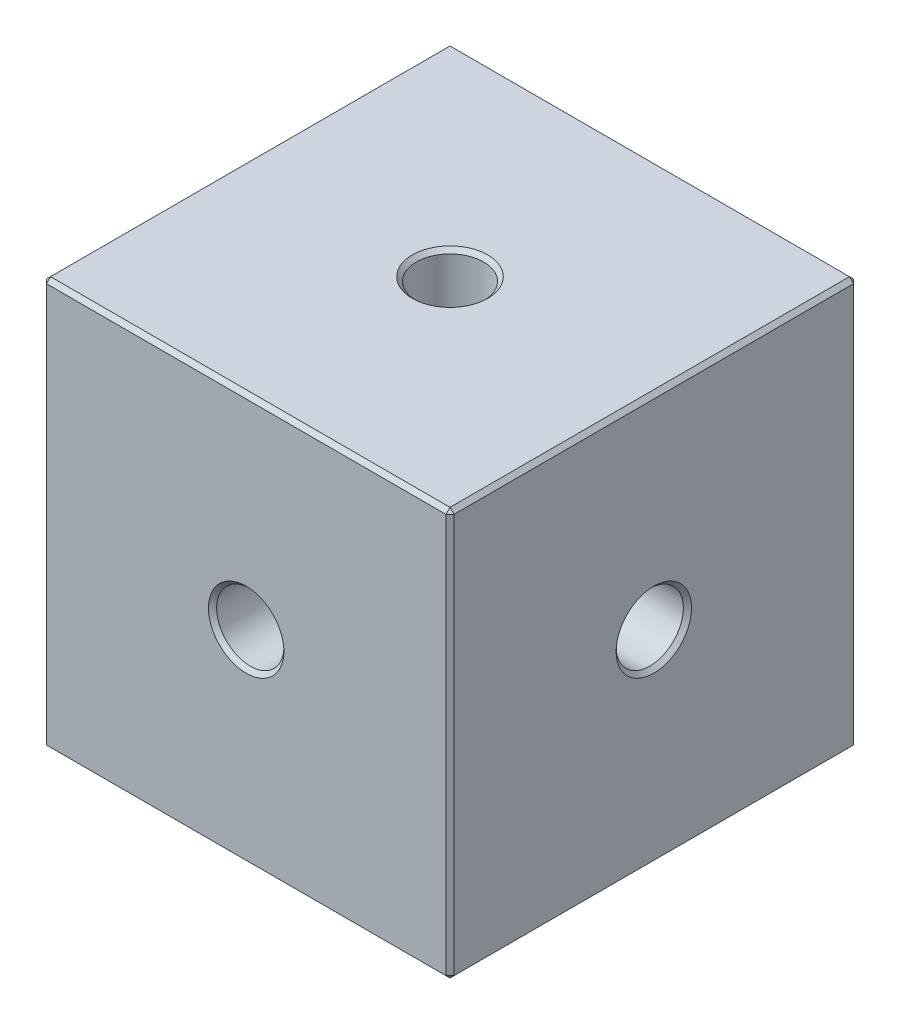
ISO-10303-21;
HEADER;
FILE_DESCRIPTION(('STEP AP214'),'2;1');
FILE_NAME('part.step','',(''),(''),'','','');
FILE_SCHEMA(('AUTOMOTIVE_DESIGN { 1 0 10303 214 1 1 1 1 }'));
ENDSEC;
DATA;
#1=APPLICATION_CONTEXT('core data for automotive mechanical design processes');
#2=APPLICATION_PROTOCOL_DEFINITION('international standard','automotive_design',2000,#1);
#3=PRODUCT_CONTEXT('',#1,'mechanical');
#4=PRODUCT('Part','Part','',(#3));
#5=PRODUCT_RELATED_PRODUCT_CATEGORY('part','',(#4));
#6=PRODUCT_DEFINITION_FORMATION('','',#4);
#7=PRODUCT_DEFINITION_CONTEXT('part definition',#1,'design');
#8=PRODUCT_DEFINITION('design','',#6,#7);
#9=PRODUCT_DEFINITION_SHAPE('','',#8);
#10=(LENGTH_UNIT() NAMED_UNIT(*) SI_UNIT(.MILLI.,.METRE.));
#11=(NAMED_UNIT(*) PLANE_ANGLE_UNIT() SI_UNIT($,.RADIAN.));
#12=(NAMED_UNIT(*) SI_UNIT($,.STERADIAN.) SOLID_ANGLE_UNIT());
#13=UNCERTAINTY_MEASURE_WITH_UNIT(LENGTH_MEASURE(1.E-05),#10,'distance_accuracy_value','');
#14=(GEOMETRIC_REPRESENTATION_CONTEXT(3) GLOBAL_UNCERTAINTY_ASSIGNED_CONTEXT((#13)) GLOBAL_UNIT_ASSIGNED_CONTEXT((#10,
#11,#12)) REPRESENTATION_CONTEXT('',''));
#15=CARTESIAN_POINT('',(0.,0.,0.));
#16=DIRECTION('',(0.,0.,1.));
#17=DIRECTION('',(1.,0.,0.));
#18=AXIS2_PLACEMENT_3D('',#15,#16,#17);
#19=CARTESIAN_POINT('',(0.,0.,10.));
#20=DIRECTION('',(0.,0.,1.));
#21=DIRECTION('',(1.,0.,0.));
#22=AXIS2_PLACEMENT_3D('',#19,#20,#21);
#23=CYLINDRICAL_SURFACE('',#22,1.65);
#24=CARTESIAN_POINT('',(0.,0.,9.80000000000001));
#25=DIRECTION('',(0.,0.,-1.));
#26=DIRECTION('',(-1.,0.,0.));
#27=AXIS2_PLACEMENT_3D('',#24,#25,#26);
#28=CIRCLE('',#27,1.65);
#29=CARTESIAN_POINT('',(-1.65,0.,9.80000000000001));
#30=VERTEX_POINT('',#29);
#31=EDGE_CURVE('E251',#30,#30,#28,.F.);
#32=ORIENTED_EDGE('',*,*,#31,.T.);
#33=EDGE_LOOP('',(#32));
#34=FACE_BOUND('',#33,.T.);
#35=CARTESIAN_POINT('',(0.,0.,0.));
#36=DIRECTION('',(0.,0.707106781186547,0.707106781186547));
#37=DIRECTION('',(0.,-0.707106781186547,0.707106781186547));
#38=AXIS2_PLACEMENT_3D('',#35,#36,#37);
#39=ELLIPSE('',#38,2.3334523779156,1.65);
#40=CARTESIAN_POINT('',(1.1667261889578,-1.1667261889578,1.1667261889578));
#41=VERTEX_POINT('',#40);
#42=CARTESIAN_POINT('',(-1.1667261889578,-1.1667261889578,1.1667261889578));
#43=VERTEX_POINT('',#42);
#44=EDGE_CURVE('E167',#41,#43,#39,.F.);
#45=ORIENTED_EDGE('',*,*,#44,.T.);
#46=CARTESIAN_POINT('',(0.,0.,0.));
#47=DIRECTION('',(0.707106781186548,0.,0.707106781186547));
#48=DIRECTION('',(-0.707106781186547,0.,0.707106781186547));
#49=AXIS2_PLACEMENT_3D('',#46,#47,#48);
#50=ELLIPSE('',#49,2.3334523779156,1.65);
#51=CARTESIAN_POINT('',(-1.1667261889578,1.1667261889578,1.1667261889578));
#52=VERTEX_POINT('',#51);
#53=EDGE_CURVE('E161',#43,#52,#50,.F.);
#54=ORIENTED_EDGE('',*,*,#53,.T.);
#55=CARTESIAN_POINT('',(0.,0.,0.));
#56=DIRECTION('',(0.,-0.707106781186547,0.707106781186547));
#57=DIRECTION('',(0.,0.707106781186547,0.707106781186547));
#58=AXIS2_PLACEMENT_3D('',#55,#56,#57);
#59=ELLIPSE('',#58,2.3334523779156,1.65);
#60=CARTESIAN_POINT('',(1.1667261889578,1.1667261889578,1.1667261889578));
#61=VERTEX_POINT('',#60);
#62=EDGE_CURVE('E181',#52,#61,#59,.F.);
#63=ORIENTED_EDGE('',*,*,#62,.T.);
#64=CARTESIAN_POINT('',(0.,0.,0.));
#65=DIRECTION('',(-0.707106781186547,0.,0.707106781186547));
#66=DIRECTION('',(0.707106781186548,0.,0.707106781186547));
#67=AXIS2_PLACEMENT_3D('',#64,#65,#66);
#68=ELLIPSE('',#67,2.3334523779156,1.65);
#69=EDGE_CURVE('E618',#61,#41,#68,.F.);
#70=ORIENTED_EDGE('',*,*,#69,.T.);
#71=EDGE_LOOP('',(#45,#54,#63,#70));
#72=FACE_BOUND('',#71,.T.);
#73=ADVANCED_FACE('F41',(#34,#72),#23,.F.);
#74=CARTESIAN_POINT('',(10.,10.,-10.));
#75=DIRECTION('',(-1.,0.,0.));
#76=DIRECTION('',(0.,0.,1.));
#77=AXIS2_PLACEMENT_3D('',#74,#75,#76);
#78=PLANE('',#77);
#79=CARTESIAN_POINT('',(10.,0.,0.));
#80=DIRECTION('',(-1.,0.,0.));
#81=DIRECTION('',(0.,0.,1.));
#82=AXIS2_PLACEMENT_3D('',#79,#80,#81);
#83=CIRCLE('',#82,1.85);
#84=CARTESIAN_POINT('',(10.,0.,1.85));
#85=VERTEX_POINT('',#84);
#86=EDGE_CURVE('E248',#85,#85,#83,.T.);
#87=ORIENTED_EDGE('',*,*,#86,.T.);
#88=EDGE_LOOP('',(#87));
#89=FACE_BOUND('',#88,.T.);
#90=DIRECTION('',(0.,0.,-1.));
#91=VECTOR('',#90,1.);
#92=CARTESIAN_POINT('',(10.,-9.8,-10.));
#93=LINE('',#92,#91);
#94=CARTESIAN_POINT('',(10.,-9.8,9.8));
#95=VERTEX_POINT('',#94);
#96=CARTESIAN_POINT('',(10.,-9.8,-9.8));
#97=VERTEX_POINT('',#96);
#98=EDGE_CURVE('E243',#95,#97,#93,.T.);
#99=ORIENTED_EDGE('',*,*,#98,.T.);
#100=DIRECTION('',(0.,1.,0.));
#101=VECTOR('',#100,1.);
#102=CARTESIAN_POINT('',(10.,10.,-9.8));
#103=LINE('',#102,#101);
#104=CARTESIAN_POINT('',(10.,9.8,-9.8));
#105=VERTEX_POINT('',#104);
#106=EDGE_CURVE('E245',#97,#105,#103,.T.);
#107=ORIENTED_EDGE('',*,*,#106,.T.);
#108=DIRECTION('',(0.,0.,1.));
#109=VECTOR('',#108,1.);
#110=CARTESIAN_POINT('',(10.,9.8,10.));
#111=LINE('',#110,#109);
#112=CARTESIAN_POINT('',(10.,9.8,9.8));
#113=VERTEX_POINT('',#112);
#114=EDGE_CURVE('E239',#105,#113,#111,.T.);
#115=ORIENTED_EDGE('',*,*,#114,.T.);
#116=DIRECTION('',(0.,-1.,0.));
#117=VECTOR('',#116,1.);
#118=CARTESIAN_POINT('',(10.,10.,9.8));
#119=LINE('',#118,#117);
#120=EDGE_CURVE('E241',#113,#95,#119,.T.);
#121=ORIENTED_EDGE('',*,*,#120,.T.);
#122=EDGE_LOOP('',(#99,#107,#115,#121));
#123=FACE_BOUND('',#122,.T.);
#124=ADVANCED_FACE('F352',(#89,#123),#78,.F.);
#125=CARTESIAN_POINT('',(-10.,10.,-10.));
#126=DIRECTION('',(0.,0.,1.));
#127=DIRECTION('',(1.,0.,0.));
#128=AXIS2_PLACEMENT_3D('',#125,#126,#127);
#129=PLANE('',#128);
#130=CARTESIAN_POINT('',(0.,0.,-10.));
#131=DIRECTION('',(0.,0.,1.));
#132=DIRECTION('',(1.,0.,0.));
#133=AXIS2_PLACEMENT_3D('',#130,#131,#132);
#134=CIRCLE('',#133,1.84999999999999);
#135=CARTESIAN_POINT('',(1.84999999999999,0.,-10.));
#136=VERTEX_POINT('',#135);
#137=EDGE_CURVE('E230',#136,#136,#134,.T.);
#138=ORIENTED_EDGE('',*,*,#137,.T.);
#139=EDGE_LOOP('',(#138));
#140=FACE_BOUND('',#139,.T.);
#141=DIRECTION('',(-1.,0.,0.));
#142=VECTOR('',#141,1.);
#143=CARTESIAN_POINT('',(-10.,-9.8,-10.));
#144=LINE('',#143,#142);
#145=CARTESIAN_POINT('',(9.8,-9.8,-10.));
#146=VERTEX_POINT('',#145);
#147=CARTESIAN_POINT('',(-9.80000000000001,-9.8,-10.));
#148=VERTEX_POINT('',#147);
#149=EDGE_CURVE('E225',#146,#148,#144,.T.);
#150=ORIENTED_EDGE('',*,*,#149,.T.);
#151=DIRECTION('',(0.,1.,0.));
#152=VECTOR('',#151,1.);
#153=CARTESIAN_POINT('',(-9.80000000000001,10.,-10.));
#154=LINE('',#153,#152);
#155=CARTESIAN_POINT('',(-9.80000000000001,9.8,-10.));
#156=VERTEX_POINT('',#155);
#157=EDGE_CURVE('E227',#148,#156,#154,.T.);
#158=ORIENTED_EDGE('',*,*,#157,.T.);
#159=DIRECTION('',(1.,0.,0.));
#160=VECTOR('',#159,1.);
#161=CARTESIAN_POINT('',(10.,9.8,-10.));
#162=LINE('',#161,#160);
#163=CARTESIAN_POINT('',(9.8,9.8,-10.));
#164=VERTEX_POINT('',#163);
#165=EDGE_CURVE('E221',#156,#164,#162,.T.);
#166=ORIENTED_EDGE('',*,*,#165,.T.);
#167=DIRECTION('',(0.,-1.,0.));
#168=VECTOR('',#167,1.);
#169=CARTESIAN_POINT('',(9.8,10.,-10.));
#170=LINE('',#169,#168);
#171=EDGE_CURVE('E223',#164,#146,#170,.T.);
#172=ORIENTED_EDGE('',*,*,#171,.T.);
#173=EDGE_LOOP('',(#150,#158,#166,#172));
#174=FACE_BOUND('',#173,.T.);
#175=ADVANCED_FACE('F373',(#140,#174),#129,.F.);
#176=CARTESIAN_POINT('',(-10.,10.,-10.));
#177=DIRECTION('',(1.,0.,0.));
#178=DIRECTION('',(0.,0.,-1.));
#179=AXIS2_PLACEMENT_3D('',#176,#177,#178);
#180=PLANE('',#179);
#181=CARTESIAN_POINT('',(-10.,0.,0.));
#182=DIRECTION('',(1.,0.,0.));
#183=DIRECTION('',(0.,0.,-1.));
#184=AXIS2_PLACEMENT_3D('',#181,#182,#183);
#185=CIRCLE('',#184,1.84999999999998);
#186=CARTESIAN_POINT('',(-10.,0.,-1.84999999999998));
#187=VERTEX_POINT('',#186);
#188=EDGE_CURVE('E215',#187,#187,#185,.T.);
#189=ORIENTED_EDGE('',*,*,#188,.T.);
#190=EDGE_LOOP('',(#189));
#191=FACE_BOUND('',#190,.T.);
#192=DIRECTION('',(0.,-1.,0.));
#193=VECTOR('',#192,1.);
#194=CARTESIAN_POINT('',(-10.,10.,-9.8));
#195=LINE('',#194,#193);
#196=CARTESIAN_POINT('',(-10.,9.8,-9.8));
#197=VERTEX_POINT('',#196);
#198=CARTESIAN_POINT('',(-10.,-9.8,-9.8));
#199=VERTEX_POINT('',#198);
#200=EDGE_CURVE('E210',#197,#199,#195,.T.);
#201=ORIENTED_EDGE('',*,*,#200,.T.);
#202=DIRECTION('',(0.,0.,1.));
#203=VECTOR('',#202,1.);
#204=CARTESIAN_POINT('',(-10.,-9.8,-10.));
#205=LINE('',#204,#203);
#206=CARTESIAN_POINT('',(-10.,-9.8,9.8));
#207=VERTEX_POINT('',#206);
#208=EDGE_CURVE('E212',#199,#207,#205,.T.);
#209=ORIENTED_EDGE('',*,*,#208,.T.);
#210=DIRECTION('',(0.,1.,0.));
#211=VECTOR('',#210,1.);
#212=CARTESIAN_POINT('',(-10.,10.,9.8));
#213=LINE('',#212,#211);
#214=CARTESIAN_POINT('',(-10.,9.8,9.8));
#215=VERTEX_POINT('',#214);
#216=EDGE_CURVE('E208',#207,#215,#213,.T.);
#217=ORIENTED_EDGE('',*,*,#216,.T.);
#218=DIRECTION('',(0.,0.,-1.));
#219=VECTOR('',#218,1.);
#220=CARTESIAN_POINT('',(-10.,9.8,-10.));
#221=LINE('',#220,#219);
#222=EDGE_CURVE('E206',#215,#197,#221,.T.);
#223=ORIENTED_EDGE('',*,*,#222,.T.);
#224=EDGE_LOOP('',(#201,#209,#217,#223));
#225=FACE_BOUND('',#224,.T.);
#226=ADVANCED_FACE('F434',(#191,#225),#180,.F.);
#227=CARTESIAN_POINT('',(-10.,10.,10.));
#228=DIRECTION('',(0.,0.,-1.));
#229=DIRECTION('',(-1.,0.,0.));
#230=AXIS2_PLACEMENT_3D('',#227,#228,#229);
#231=PLANE('',#230);
#232=CARTESIAN_POINT('',(0.,0.,10.));
#233=DIRECTION('',(0.,0.,-1.));
#234=DIRECTION('',(-1.,0.,0.));
#235=AXIS2_PLACEMENT_3D('',#232,#233,#234);
#236=CIRCLE('',#235,1.84999999999999);
#237=CARTESIAN_POINT('',(-1.84999999999999,0.,10.));
#238=VERTEX_POINT('',#237);
#239=EDGE_CURVE('E263',#238,#238,#236,.T.);
#240=ORIENTED_EDGE('',*,*,#239,.T.);
#241=EDGE_LOOP('',(#240));
#242=FACE_BOUND('',#241,.T.);
#243=DIRECTION('',(-1.,0.,0.));
#244=VECTOR('',#243,1.);
#245=CARTESIAN_POINT('',(-10.,9.8,10.));
#246=LINE('',#245,#244);
#247=CARTESIAN_POINT('',(9.80000000000001,9.8,10.));
#248=VERTEX_POINT('',#247);
#249=CARTESIAN_POINT('',(-9.8,9.8,10.));
#250=VERTEX_POINT('',#249);
#251=EDGE_CURVE('E254',#248,#250,#246,.T.);
#252=ORIENTED_EDGE('',*,*,#251,.T.);
#253=DIRECTION('',(0.,-1.,0.));
#254=VECTOR('',#253,1.);
#255=CARTESIAN_POINT('',(-9.8,10.,10.));
#256=LINE('',#255,#254);
#257=CARTESIAN_POINT('',(-9.8,-9.8,10.));
#258=VERTEX_POINT('',#257);
#259=EDGE_CURVE('E260',#250,#258,#256,.T.);
#260=ORIENTED_EDGE('',*,*,#259,.T.);
#261=DIRECTION('',(1.,0.,0.));
#262=VECTOR('',#261,1.);
#263=CARTESIAN_POINT('',(-10.,-9.8,10.));
#264=LINE('',#263,#262);
#265=CARTESIAN_POINT('',(9.80000000000001,-9.8,10.));
#266=VERTEX_POINT('',#265);
#267=EDGE_CURVE('E258',#258,#266,#264,.T.);
#268=ORIENTED_EDGE('',*,*,#267,.T.);
#269=DIRECTION('',(0.,1.,0.));
#270=VECTOR('',#269,1.);
#271=CARTESIAN_POINT('',(9.80000000000001,10.,10.));
#272=LINE('',#271,#270);
#273=EDGE_CURVE('E256',#266,#248,#272,.T.);
#274=ORIENTED_EDGE('',*,*,#273,.T.);
#275=EDGE_LOOP('',(#252,#260,#268,#274));
#276=FACE_BOUND('',#275,.T.);
#277=ADVANCED_FACE('F439',(#242,#276),#231,.F.);
#278=CARTESIAN_POINT('',(0.,10.,0.));
#279=DIRECTION('',(0.,1.,0.));
#280=DIRECTION('',(0.,0.,1.));
#281=AXIS2_PLACEMENT_3D('',#278,#279,#280);
#282=PLANE('',#281);
#283=DIRECTION('',(0.,0.,1.));
#284=VECTOR('',#283,1.);
#285=CARTESIAN_POINT('',(-9.8,10.,10.));
#286=LINE('',#285,#284);
#287=CARTESIAN_POINT('',(-9.80000000000001,10.,-9.8));
#288=VERTEX_POINT('',#287);
#289=CARTESIAN_POINT('',(-9.8,10.,9.80000000000001));
#290=VERTEX_POINT('',#289);
#291=EDGE_CURVE('E59',#288,#290,#286,.T.);
#292=ORIENTED_EDGE('',*,*,#291,.T.);
#293=DIRECTION('',(1.,0.,0.));
#294=VECTOR('',#293,1.);
#295=CARTESIAN_POINT('',(10.,10.,9.80000000000001));
#296=LINE('',#295,#294);
#297=CARTESIAN_POINT('',(9.80000000000001,10.,9.80000000000001));
#298=VERTEX_POINT('',#297);
#299=EDGE_CURVE('E51',#290,#298,#296,.T.);
#300=ORIENTED_EDGE('',*,*,#299,.T.);
#301=DIRECTION('',(0.,0.,-1.));
#302=VECTOR('',#301,1.);
#303=CARTESIAN_POINT('',(9.8,10.,-10.));
#304=LINE('',#303,#302);
#305=CARTESIAN_POINT('',(9.8,10.,-9.8));
#306=VERTEX_POINT('',#305);
#307=EDGE_CURVE('E269',#298,#306,#304,.T.);
#308=ORIENTED_EDGE('',*,*,#307,.T.);
#309=DIRECTION('',(-1.,0.,0.));
#310=VECTOR('',#309,1.);
#311=CARTESIAN_POINT('',(-10.,10.,-9.8));
#312=LINE('',#311,#310);
#313=EDGE_CURVE('E64',#306,#288,#312,.T.);
#314=ORIENTED_EDGE('',*,*,#313,.T.);
#315=EDGE_LOOP('',(#292,#300,#308,#314));
#316=FACE_BOUND('',#315,.T.);
#317=CARTESIAN_POINT('',(0.,10.,0.));
#318=DIRECTION('',(0.,1.,0.));
#319=DIRECTION('',(0.,0.,1.));
#320=AXIS2_PLACEMENT_3D('',#317,#318,#319);
#321=CIRCLE('',#320,1.85000000000001);
#322=CARTESIAN_POINT('',(0.,10.,1.85000000000001));
#323=VERTEX_POINT('',#322);
#324=EDGE_CURVE('E266',#323,#323,#321,.F.);
#325=ORIENTED_EDGE('',*,*,#324,.T.);
#326=EDGE_LOOP('',(#325));
#327=FACE_BOUND('',#326,.T.);
#328=ADVANCED_FACE('F420',(#316,#327),#282,.T.);
#329=CARTESIAN_POINT('',(0.,-10.,0.));
#330=DIRECTION('',(0.,1.,0.));
#331=DIRECTION('',(0.,0.,1.));
#332=AXIS2_PLACEMENT_3D('',#329,#330,#331);
#333=PLANE('',#332);
#334=CARTESIAN_POINT('',(0.,-10.,0.));
#335=DIRECTION('',(0.,1.,0.));
#336=DIRECTION('',(0.,0.,1.));
#337=AXIS2_PLACEMENT_3D('',#334,#335,#336);
#338=CIRCLE('',#337,1.85);
#339=CARTESIAN_POINT('',(0.,-10.,1.85));
#340=VERTEX_POINT('',#339);
#341=EDGE_CURVE('E200',#340,#340,#338,.T.);
#342=ORIENTED_EDGE('',*,*,#341,.T.);
#343=EDGE_LOOP('',(#342));
#344=FACE_BOUND('',#343,.T.);
#345=DIRECTION('',(-1.,0.,0.));
#346=VECTOR('',#345,1.);
#347=CARTESIAN_POINT('',(0.,-10.,9.80000000000001));
#348=LINE('',#347,#346);
#349=CARTESIAN_POINT('',(9.80000000000001,-10.,9.80000000000001));
#350=VERTEX_POINT('',#349);
#351=CARTESIAN_POINT('',(-9.8,-10.,9.80000000000001));
#352=VERTEX_POINT('',#351);
#353=EDGE_CURVE('E191',#350,#352,#348,.T.);
#354=ORIENTED_EDGE('',*,*,#353,.T.);
#355=DIRECTION('',(0.,0.,-1.));
#356=VECTOR('',#355,1.);
#357=CARTESIAN_POINT('',(-9.8,-10.,0.));
#358=LINE('',#357,#356);
#359=CARTESIAN_POINT('',(-9.80000000000001,-10.,-9.8));
#360=VERTEX_POINT('',#359);
#361=EDGE_CURVE('E197',#352,#360,#358,.T.);
#362=ORIENTED_EDGE('',*,*,#361,.T.);
#363=DIRECTION('',(1.,0.,0.));
#364=VECTOR('',#363,1.);
#365=CARTESIAN_POINT('',(0.,-10.,-9.8));
#366=LINE('',#365,#364);
#367=CARTESIAN_POINT('',(9.8,-10.,-9.8));
#368=VERTEX_POINT('',#367);
#369=EDGE_CURVE('E195',#360,#368,#366,.T.);
#370=ORIENTED_EDGE('',*,*,#369,.T.);
#371=DIRECTION('',(0.,0.,1.));
#372=VECTOR('',#371,1.);
#373=CARTESIAN_POINT('',(9.8,-10.,0.));
#374=LINE('',#373,#372);
#375=EDGE_CURVE('E193',#368,#350,#374,.T.);
#376=ORIENTED_EDGE('',*,*,#375,.T.);
#377=EDGE_LOOP('',(#354,#362,#370,#376));
#378=FACE_BOUND('',#377,.T.);
#379=ADVANCED_FACE('F413',(#344,#378),#333,.F.);
#380=CARTESIAN_POINT('',(0.,0.,-9.8));
#381=DIRECTION('',(0.,0.,1.));
#382=DIRECTION('',(1.,0.,0.));
#383=AXIS2_PLACEMENT_3D('',#380,#381,#382);
#384=CIRCLE('',#383,1.65);
#385=CARTESIAN_POINT('',(1.65,0.,-9.8));
#386=VERTEX_POINT('',#385);
#387=EDGE_CURVE('E233',#386,#386,#384,.F.);
#388=ORIENTED_EDGE('',*,*,#387,.T.);
#389=EDGE_LOOP('',(#388));
#390=FACE_BOUND('',#389,.T.);
#391=CARTESIAN_POINT('',(0.,0.,0.));
#392=DIRECTION('',(0.,-0.707106781186547,0.707106781186547));
#393=DIRECTION('',(0.,0.707106781186547,0.707106781186547));
#394=AXIS2_PLACEMENT_3D('',#391,#392,#393);
#395=ELLIPSE('',#394,2.3334523779156,1.65);
#396=CARTESIAN_POINT('',(-1.1667261889578,-1.1667261889578,-1.1667261889578));
#397=VERTEX_POINT('',#396);
#398=CARTESIAN_POINT('',(1.1667261889578,-1.1667261889578,-1.1667261889578));
#399=VERTEX_POINT('',#398);
#400=EDGE_CURVE('E174',#397,#399,#395,.T.);
#401=ORIENTED_EDGE('',*,*,#400,.T.);
#402=CARTESIAN_POINT('',(0.,0.,0.));
#403=DIRECTION('',(0.707106781186548,0.,0.707106781186547));
#404=DIRECTION('',(-0.707106781186547,0.,0.707106781186547));
#405=AXIS2_PLACEMENT_3D('',#402,#403,#404);
#406=ELLIPSE('',#405,2.3334523779156,1.65);
#407=CARTESIAN_POINT('',(1.1667261889578,1.1667261889578,-1.1667261889578));
#408=VERTEX_POINT('',#407);
#409=EDGE_CURVE('E619',#399,#408,#406,.T.);
#410=ORIENTED_EDGE('',*,*,#409,.T.);
#411=CARTESIAN_POINT('',(0.,0.,0.));
#412=DIRECTION('',(0.,0.707106781186547,0.707106781186547));
#413=DIRECTION('',(0.,-0.707106781186547,0.707106781186547));
#414=AXIS2_PLACEMENT_3D('',#411,#412,#413);
#415=ELLIPSE('',#414,2.3334523779156,1.65);
#416=CARTESIAN_POINT('',(-1.1667261889578,1.1667261889578,-1.1667261889578));
#417=VERTEX_POINT('',#416);
#418=EDGE_CURVE('E176',#408,#417,#415,.T.);
#419=ORIENTED_EDGE('',*,*,#418,.T.);
#420=CARTESIAN_POINT('',(0.,0.,0.));
#421=DIRECTION('',(-0.707106781186547,0.,0.707106781186547));
#422=DIRECTION('',(0.707106781186548,0.,0.707106781186547));
#423=AXIS2_PLACEMENT_3D('',#420,#421,#422);
#424=ELLIPSE('',#423,2.3334523779156,1.65);
#425=EDGE_CURVE('E158',#417,#397,#424,.T.);
#426=ORIENTED_EDGE('',*,*,#425,.T.);
#427=EDGE_LOOP('',(#401,#410,#419,#426));
#428=FACE_BOUND('',#427,.T.);
#429=ADVANCED_FACE('F172',(#390,#428),#23,.F.);
#430=CARTESIAN_POINT('',(0.,10.,0.));
#431=DIRECTION('',(0.,1.,0.));
#432=DIRECTION('',(0.,0.,1.));
#433=AXIS2_PLACEMENT_3D('',#430,#431,#432);
#434=CYLINDRICAL_SURFACE('',#433,1.65);
#435=CARTESIAN_POINT('',(0.,9.79999999999999,0.));
#436=DIRECTION('',(0.,1.,0.));
#437=DIRECTION('',(0.,0.,1.));
#438=AXIS2_PLACEMENT_3D('',#435,#436,#437);
#439=CIRCLE('',#438,1.65);
#440=CARTESIAN_POINT('',(0.,9.79999999999999,1.65));
#441=VERTEX_POINT('',#440);
#442=EDGE_CURVE('E11',#441,#441,#439,.T.);
#443=ORIENTED_EDGE('',*,*,#442,.T.);
#444=EDGE_LOOP('',(#443));
#445=FACE_BOUND('',#444,.T.);
#446=ORIENTED_EDGE('',*,*,#62,.F.);
#447=CARTESIAN_POINT('',(0.,0.,0.));
#448=DIRECTION('',(0.707106781186547,0.707106781186547,0.));
#449=DIRECTION('',(-0.707106781186547,0.707106781186547,0.));
#450=AXIS2_PLACEMENT_3D('',#447,#448,#449);
#451=ELLIPSE('',#450,2.3334523779156,1.65);
#452=EDGE_CURVE('E177',#52,#417,#451,.F.);
#453=ORIENTED_EDGE('',*,*,#452,.T.);
#454=ORIENTED_EDGE('',*,*,#418,.F.);
#455=CARTESIAN_POINT('',(0.,0.,0.));
#456=DIRECTION('',(-0.707106781186547,0.707106781186547,0.));
#457=DIRECTION('',(0.707106781186547,0.707106781186547,0.));
#458=AXIS2_PLACEMENT_3D('',#455,#456,#457);
#459=ELLIPSE('',#458,2.3334523779156,1.65);
#460=EDGE_CURVE('E185',#408,#61,#459,.F.);
#461=ORIENTED_EDGE('',*,*,#460,.T.);
#462=EDGE_LOOP('',(#446,#453,#454,#461));
#463=FACE_BOUND('',#462,.T.);
#464=ADVANCED_FACE('F412',(#445,#463),#434,.F.);
#465=CARTESIAN_POINT('',(0.,-9.8,0.));
#466=DIRECTION('',(0.,1.,0.));
#467=DIRECTION('',(0.,0.,1.));
#468=AXIS2_PLACEMENT_3D('',#465,#466,#467);
#469=CIRCLE('',#468,1.65);
#470=CARTESIAN_POINT('',(0.,-9.8,1.65));
#471=VERTEX_POINT('',#470);
#472=EDGE_CURVE('E203',#471,#471,#469,.F.);
#473=ORIENTED_EDGE('',*,*,#472,.T.);
#474=EDGE_LOOP('',(#473));
#475=FACE_BOUND('',#474,.T.);
#476=ORIENTED_EDGE('',*,*,#44,.F.);
#477=CARTESIAN_POINT('',(0.,0.,0.));
#478=DIRECTION('',(0.707106781186547,0.707106781186547,0.));
#479=DIRECTION('',(-0.707106781186547,0.707106781186547,0.));
#480=AXIS2_PLACEMENT_3D('',#477,#478,#479);
#481=ELLIPSE('',#480,2.3334523779156,1.65);
#482=EDGE_CURVE('E166',#41,#399,#481,.T.);
#483=ORIENTED_EDGE('',*,*,#482,.T.);
#484=ORIENTED_EDGE('',*,*,#400,.F.);
#485=CARTESIAN_POINT('',(0.,0.,0.));
#486=DIRECTION('',(-0.707106781186547,0.707106781186547,0.));
#487=DIRECTION('',(0.707106781186547,0.707106781186547,0.));
#488=AXIS2_PLACEMENT_3D('',#485,#486,#487);
#489=ELLIPSE('',#488,2.3334523779156,1.65);
#490=EDGE_CURVE('E155',#397,#43,#489,.T.);
#491=ORIENTED_EDGE('',*,*,#490,.T.);
#492=EDGE_LOOP('',(#476,#483,#484,#491));
#493=FACE_BOUND('',#492,.T.);
#494=ADVANCED_FACE('F180',(#475,#493),#434,.F.);
#495=CARTESIAN_POINT('',(10.,0.,0.));
#496=DIRECTION('',(1.,0.,0.));
#497=DIRECTION('',(0.,0.,-1.));
#498=AXIS2_PLACEMENT_3D('',#495,#496,#497);
#499=CYLINDRICAL_SURFACE('',#498,1.65);
#500=CARTESIAN_POINT('',(-9.80000000000002,0.,0.));
#501=DIRECTION('',(1.,0.,0.));
#502=DIRECTION('',(0.,0.,-1.));
#503=AXIS2_PLACEMENT_3D('',#500,#501,#502);
#504=CIRCLE('',#503,1.65);
#505=CARTESIAN_POINT('',(-9.80000000000002,0.,-1.65));
#506=VERTEX_POINT('',#505);
#507=EDGE_CURVE('E218',#506,#506,#504,.F.);
#508=ORIENTED_EDGE('',*,*,#507,.T.);
#509=EDGE_LOOP('',(#508));
#510=FACE_BOUND('',#509,.T.);
#511=ORIENTED_EDGE('',*,*,#490,.F.);
#512=ORIENTED_EDGE('',*,*,#425,.F.);
#513=ORIENTED_EDGE('',*,*,#452,.F.);
#514=ORIENTED_EDGE('',*,*,#53,.F.);
#515=EDGE_LOOP('',(#511,#512,#513,#514));
#516=FACE_BOUND('',#515,.T.);
#517=ADVANCED_FACE('F157',(#510,#516),#499,.F.);
#518=CARTESIAN_POINT('',(9.79999999999999,0.,0.));
#519=DIRECTION('',(-1.,0.,0.));
#520=DIRECTION('',(0.,0.,1.));
#521=AXIS2_PLACEMENT_3D('',#518,#519,#520);
#522=CIRCLE('',#521,1.65);
#523=CARTESIAN_POINT('',(9.79999999999999,0.,1.65));
#524=VERTEX_POINT('',#523);
#525=EDGE_CURVE('E236',#524,#524,#522,.F.);
#526=ORIENTED_EDGE('',*,*,#525,.T.);
#527=EDGE_LOOP('',(#526));
#528=FACE_BOUND('',#527,.T.);
#529=ORIENTED_EDGE('',*,*,#409,.F.);
#530=ORIENTED_EDGE('',*,*,#482,.F.);
#531=ORIENTED_EDGE('',*,*,#69,.F.);
#532=ORIENTED_EDGE('',*,*,#460,.F.);
#533=EDGE_LOOP('',(#529,#530,#531,#532));
#534=FACE_BOUND('',#533,.T.);
#535=ADVANCED_FACE('F451',(#528,#534),#499,.F.);
#536=CARTESIAN_POINT('',(0.,-10.,0.));
#537=DIRECTION('',(0.,-1.,0.));
#538=DIRECTION('',(0.,0.,-1.));
#539=AXIS2_PLACEMENT_3D('',#536,#537,#538);
#540=CONICAL_SURFACE('',#539,1.85,0.785398163397443);
#541=ORIENTED_EDGE('',*,*,#472,.F.);
#542=EDGE_LOOP('',(#541));
#543=FACE_BOUND('',#542,.T.);
#544=ORIENTED_EDGE('',*,*,#341,.F.);
#545=EDGE_LOOP('',(#544));
#546=FACE_BOUND('',#545,.T.);
#547=ADVANCED_FACE('F445',(#543,#546),#540,.F.);
#548=CARTESIAN_POINT('',(-10.,0.,0.));
#549=DIRECTION('',(-1.,0.,0.));
#550=DIRECTION('',(0.,0.,1.));
#551=AXIS2_PLACEMENT_3D('',#548,#549,#550);
#552=CONICAL_SURFACE('',#551,1.84999999999998,0.785398163397451);
#553=ORIENTED_EDGE('',*,*,#507,.F.);
#554=EDGE_LOOP('',(#553));
#555=FACE_BOUND('',#554,.T.);
#556=ORIENTED_EDGE('',*,*,#188,.F.);
#557=EDGE_LOOP('',(#556));
#558=FACE_BOUND('',#557,.T.);
#559=ADVANCED_FACE('F429',(#555,#558),#552,.F.);
#560=CARTESIAN_POINT('',(0.,0.,-10.));
#561=DIRECTION('',(0.,0.,-1.));
#562=DIRECTION('',(-1.,0.,0.));
#563=AXIS2_PLACEMENT_3D('',#560,#561,#562);
#564=CONICAL_SURFACE('',#563,1.84999999999999,0.785398163397443);
#565=ORIENTED_EDGE('',*,*,#387,.F.);
#566=EDGE_LOOP('',(#565));
#567=FACE_BOUND('',#566,.T.);
#568=ORIENTED_EDGE('',*,*,#137,.F.);
#569=EDGE_LOOP('',(#568));
#570=FACE_BOUND('',#569,.T.);
#571=ADVANCED_FACE('F425',(#567,#570),#564,.F.);
#572=CARTESIAN_POINT('',(9.79999999999999,0.,0.));
#573=DIRECTION('',(1.,0.,0.));
#574=DIRECTION('',(0.,0.,-1.));
#575=AXIS2_PLACEMENT_3D('',#572,#573,#574);
#576=CONICAL_SURFACE('',#575,1.65,0.785398163397451);
#577=ORIENTED_EDGE('',*,*,#86,.F.);
#578=EDGE_LOOP('',(#577));
#579=FACE_BOUND('',#578,.T.);
#580=ORIENTED_EDGE('',*,*,#525,.F.);
#581=EDGE_LOOP('',(#580));
#582=FACE_BOUND('',#581,.T.);
#583=ADVANCED_FACE('F428',(#579,#582),#576,.F.);
#584=CARTESIAN_POINT('',(0.,0.,9.80000000000001));
#585=DIRECTION('',(0.,0.,1.));
#586=DIRECTION('',(1.,0.,0.));
#587=AXIS2_PLACEMENT_3D('',#584,#585,#586);
#588=CONICAL_SURFACE('',#587,1.65,0.785398163397444);
#589=ORIENTED_EDGE('',*,*,#239,.F.);
#590=EDGE_LOOP('',(#589));
#591=FACE_BOUND('',#590,.T.);
#592=ORIENTED_EDGE('',*,*,#31,.F.);
#593=EDGE_LOOP('',(#592));
#594=FACE_BOUND('',#593,.T.);
#595=ADVANCED_FACE('F467',(#591,#594),#588,.F.);
#596=CARTESIAN_POINT('',(9.8,10.,0.));
#597=DIRECTION('',(0.707106781186547,0.707106781186547,0.));
#598=DIRECTION('',(0.,0.,1.));
#599=AXIS2_PLACEMENT_3D('',#596,#597,#598);
#600=PLANE('',#599);
#601=DIRECTION('',(0.707106781186547,-0.707106781186547,0.));
#602=VECTOR('',#601,1.);
#603=CARTESIAN_POINT('',(10.,9.8,-9.8));
#604=LINE('',#603,#602);
#605=EDGE_CURVE('E46',#306,#105,#604,.T.);
#606=ORIENTED_EDGE('',*,*,#605,.F.);
#607=ORIENTED_EDGE('',*,*,#307,.F.);
#608=DIRECTION('',(-0.707106781186548,0.707106781186548,0.));
#609=VECTOR('',#608,1.);
#610=CARTESIAN_POINT('',(9.9,9.9,9.80000000000001));
#611=LINE('',#610,#609);
#612=EDGE_CURVE('E333',#113,#298,#611,.T.);
#613=ORIENTED_EDGE('',*,*,#612,.F.);
#614=ORIENTED_EDGE('',*,*,#114,.F.);
#615=EDGE_LOOP('',(#606,#607,#613,#614));
#616=FACE_BOUND('',#615,.T.);
#617=ADVANCED_FACE('F349',(#616),#600,.T.);
#618=CARTESIAN_POINT('',(10.,9.8,-9.8));
#619=DIRECTION('',(0.577350269189626,0.577350269189626,-0.577350269189626));
#620=DIRECTION('',(-0.707106781186547,0.,-0.707106781186547));
#621=AXIS2_PLACEMENT_3D('',#618,#619,#620);
#622=PLANE('',#621);
#623=DIRECTION('',(0.,0.707106781186547,0.707106781186547));
#624=VECTOR('',#623,1.);
#625=CARTESIAN_POINT('',(9.8,9.9,-9.9));
#626=LINE('',#625,#624);
#627=EDGE_CURVE('E329',#306,#164,#626,.F.);
#628=ORIENTED_EDGE('',*,*,#627,.F.);
#629=ORIENTED_EDGE('',*,*,#605,.T.);
#630=DIRECTION('',(0.707106781186547,0.,0.707106781186547));
#631=VECTOR('',#630,1.);
#632=CARTESIAN_POINT('',(10.,9.8,-9.8));
#633=LINE('',#632,#631);
#634=EDGE_CURVE('E332',#164,#105,#633,.T.);
#635=ORIENTED_EDGE('',*,*,#634,.F.);
#636=EDGE_LOOP('',(#628,#629,#635));
#637=FACE_BOUND('',#636,.T.);
#638=ADVANCED_FACE('F346',(#637),#622,.T.);
#639=CARTESIAN_POINT('',(9.80000000000001,9.8,10.));
#640=DIRECTION('',(0.577350269189629,0.577350269189624,0.577350269189624));
#641=DIRECTION('',(0.707106781186544,0.,-0.707106781186551));
#642=AXIS2_PLACEMENT_3D('',#639,#640,#641);
#643=PLANE('',#642);
#644=DIRECTION('',(-0.707106781186544,0.,0.707106781186551));
#645=VECTOR('',#644,1.);
#646=CARTESIAN_POINT('',(9.80000000000001,9.8,10.));
#647=LINE('',#646,#645);
#648=EDGE_CURVE('E324',#113,#248,#647,.T.);
#649=ORIENTED_EDGE('',*,*,#648,.F.);
#650=ORIENTED_EDGE('',*,*,#612,.T.);
#651=DIRECTION('',(0.,-0.707106781186547,0.707106781186547));
#652=VECTOR('',#651,1.);
#653=CARTESIAN_POINT('',(9.80000000000001,9.8,10.));
#654=LINE('',#653,#652);
#655=EDGE_CURVE('E327',#248,#298,#654,.F.);
#656=ORIENTED_EDGE('',*,*,#655,.F.);
#657=EDGE_LOOP('',(#649,#650,#656));
#658=FACE_BOUND('',#657,.T.);
#659=ADVANCED_FACE('F397',(#658),#643,.T.);
#660=CARTESIAN_POINT('',(9.8,10.,-10.));
#661=DIRECTION('',(-0.707106781186547,0.,0.707106781186547));
#662=DIRECTION('',(0.,-1.,0.));
#663=AXIS2_PLACEMENT_3D('',#660,#661,#662);
#664=PLANE('',#663);
#665=ORIENTED_EDGE('',*,*,#634,.T.);
#666=ORIENTED_EDGE('',*,*,#106,.F.);
#667=DIRECTION('',(-0.707106781186547,0.,-0.707106781186547));
#668=VECTOR('',#667,1.);
#669=CARTESIAN_POINT('',(9.9,-9.8,-9.9));
#670=LINE('',#669,#668);
#671=EDGE_CURVE('E318',#146,#97,#670,.F.);
#672=ORIENTED_EDGE('',*,*,#671,.F.);
#673=ORIENTED_EDGE('',*,*,#171,.F.);
#674=EDGE_LOOP('',(#665,#666,#672,#673));
#675=FACE_BOUND('',#674,.T.);
#676=ADVANCED_FACE('F357',(#675),#664,.F.);
#677=CARTESIAN_POINT('',(0.,10.,-9.8));
#678=DIRECTION('',(0.,0.707106781186547,-0.707106781186547));
#679=DIRECTION('',(1.,0.,0.));
#680=AXIS2_PLACEMENT_3D('',#677,#678,#679);
#681=PLANE('',#680);
#682=ORIENTED_EDGE('',*,*,#627,.T.);
#683=ORIENTED_EDGE('',*,*,#165,.F.);
#684=DIRECTION('',(0.,-0.707106781186547,-0.707106781186547));
#685=VECTOR('',#684,1.);
#686=CARTESIAN_POINT('',(-9.80000000000001,9.8,-10.));
#687=LINE('',#686,#685);
#688=EDGE_CURVE('E315',#288,#156,#687,.T.);
#689=ORIENTED_EDGE('',*,*,#688,.F.);
#690=ORIENTED_EDGE('',*,*,#313,.F.);
#691=EDGE_LOOP('',(#682,#683,#689,#690));
#692=FACE_BOUND('',#691,.T.);
#693=ADVANCED_FACE('F386',(#692),#681,.T.);
#694=CARTESIAN_POINT('',(-9.8,10.,0.));
#695=DIRECTION('',(-0.707106781186547,0.707106781186547,0.));
#696=DIRECTION('',(0.,0.,-1.));
#697=AXIS2_PLACEMENT_3D('',#694,#695,#696);
#698=PLANE('',#697);
#699=DIRECTION('',(-0.707106781186547,-0.707106781186547,0.));
#700=VECTOR('',#699,1.);
#701=CARTESIAN_POINT('',(-10.,9.8,9.8));
#702=LINE('',#701,#700);
#703=EDGE_CURVE('E309',#290,#215,#702,.T.);
#704=ORIENTED_EDGE('',*,*,#703,.F.);
#705=ORIENTED_EDGE('',*,*,#291,.F.);
#706=DIRECTION('',(0.707106781186548,0.707106781186548,0.));
#707=VECTOR('',#706,1.);
#708=CARTESIAN_POINT('',(-9.9,9.9,-9.8));
#709=LINE('',#708,#707);
#710=EDGE_CURVE('E312',#197,#288,#709,.T.);
#711=ORIENTED_EDGE('',*,*,#710,.F.);
#712=ORIENTED_EDGE('',*,*,#222,.F.);
#713=EDGE_LOOP('',(#704,#705,#711,#712));
#714=FACE_BOUND('',#713,.T.);
#715=ADVANCED_FACE('F388',(#714),#698,.T.);
#716=CARTESIAN_POINT('',(0.,10.,9.80000000000001));
#717=DIRECTION('',(0.,0.707106781186547,0.707106781186547));
#718=DIRECTION('',(-1.,0.,0.));
#719=AXIS2_PLACEMENT_3D('',#716,#717,#718);
#720=PLANE('',#719);
#721=ORIENTED_EDGE('',*,*,#655,.T.);
#722=ORIENTED_EDGE('',*,*,#299,.F.);
#723=DIRECTION('',(0.,0.707106781186547,-0.707106781186547));
#724=VECTOR('',#723,1.);
#725=CARTESIAN_POINT('',(-9.8,9.9,9.9));
#726=LINE('',#725,#724);
#727=EDGE_CURVE('E306',#250,#290,#726,.T.);
#728=ORIENTED_EDGE('',*,*,#727,.F.);
#729=ORIENTED_EDGE('',*,*,#251,.F.);
#730=EDGE_LOOP('',(#721,#722,#728,#729));
#731=FACE_BOUND('',#730,.T.);
#732=ADVANCED_FACE('F394',(#731),#720,.T.);
#733=CARTESIAN_POINT('',(10.,10.,9.8));
#734=DIRECTION('',(-0.707106781186551,0.,-0.707106781186544));
#735=DIRECTION('',(0.,-1.,0.));
#736=AXIS2_PLACEMENT_3D('',#733,#734,#735);
#737=PLANE('',#736);
#738=ORIENTED_EDGE('',*,*,#648,.T.);
#739=ORIENTED_EDGE('',*,*,#273,.F.);
#740=DIRECTION('',(0.707106781186544,0.,-0.707106781186551));
#741=VECTOR('',#740,1.);
#742=CARTESIAN_POINT('',(9.9,-9.8,9.9));
#743=LINE('',#742,#741);
#744=EDGE_CURVE('E303',#95,#266,#743,.F.);
#745=ORIENTED_EDGE('',*,*,#744,.F.);
#746=ORIENTED_EDGE('',*,*,#120,.F.);
#747=EDGE_LOOP('',(#738,#739,#745,#746));
#748=FACE_BOUND('',#747,.T.);
#749=ADVANCED_FACE('F550',(#748),#737,.F.);
#750=CARTESIAN_POINT('',(10.,-9.8,-10.));
#751=DIRECTION('',(-0.707106781186547,0.707106781186547,0.));
#752=DIRECTION('',(0.,0.,-1.));
#753=AXIS2_PLACEMENT_3D('',#750,#751,#752);
#754=PLANE('',#753);
#755=DIRECTION('',(0.707106781186547,0.707106781186547,0.));
#756=VECTOR('',#755,1.);
#757=CARTESIAN_POINT('',(9.8,-10.,-9.8));
#758=LINE('',#757,#756);
#759=EDGE_CURVE('E321',#97,#368,#758,.F.);
#760=ORIENTED_EDGE('',*,*,#759,.F.);
#761=ORIENTED_EDGE('',*,*,#98,.F.);
#762=DIRECTION('',(-0.707106781186548,-0.707106781186548,0.));
#763=VECTOR('',#762,1.);
#764=CARTESIAN_POINT('',(9.80000000000001,-10.,9.80000000000001));
#765=LINE('',#764,#763);
#766=EDGE_CURVE('E300',#350,#95,#765,.F.);
#767=ORIENTED_EDGE('',*,*,#766,.F.);
#768=ORIENTED_EDGE('',*,*,#375,.F.);
#769=EDGE_LOOP('',(#760,#761,#767,#768));
#770=FACE_BOUND('',#769,.T.);
#771=ADVANCED_FACE('F361',(#770),#754,.F.);
#772=CARTESIAN_POINT('',(9.8,-10.,-9.8));
#773=DIRECTION('',(0.577350269189626,-0.577350269189626,-0.577350269189626));
#774=DIRECTION('',(-0.707106781186547,0.,-0.707106781186547));
#775=AXIS2_PLACEMENT_3D('',#772,#773,#774);
#776=PLANE('',#775);
#777=ORIENTED_EDGE('',*,*,#671,.T.);
#778=ORIENTED_EDGE('',*,*,#759,.T.);
#779=DIRECTION('',(0.,-0.707106781186547,0.707106781186547));
#780=VECTOR('',#779,1.);
#781=CARTESIAN_POINT('',(9.8,-10.,-9.8));
#782=LINE('',#781,#780);
#783=EDGE_CURVE('E297',#146,#368,#782,.T.);
#784=ORIENTED_EDGE('',*,*,#783,.F.);
#785=EDGE_LOOP('',(#777,#778,#784));
#786=FACE_BOUND('',#785,.T.);
#787=ADVANCED_FACE('F365',(#786),#776,.T.);
#788=CARTESIAN_POINT('',(-9.80000000000001,9.8,-10.));
#789=DIRECTION('',(-0.577350269189626,0.577350269189626,-0.577350269189626));
#790=DIRECTION('',(-0.707106781186547,0.,0.707106781186547));
#791=AXIS2_PLACEMENT_3D('',#788,#789,#790);
#792=PLANE('',#791);
#793=ORIENTED_EDGE('',*,*,#710,.T.);
#794=ORIENTED_EDGE('',*,*,#688,.T.);
#795=DIRECTION('',(0.707106781186547,0.,-0.707106781186547));
#796=VECTOR('',#795,1.);
#797=CARTESIAN_POINT('',(-9.80000000000001,9.8,-10.));
#798=LINE('',#797,#796);
#799=EDGE_CURVE('E295',#197,#156,#798,.T.);
#800=ORIENTED_EDGE('',*,*,#799,.F.);
#801=EDGE_LOOP('',(#793,#794,#800));
#802=FACE_BOUND('',#801,.T.);
#803=ADVANCED_FACE('F383',(#802),#792,.T.);
#804=CARTESIAN_POINT('',(-10.,9.8,9.8));
#805=DIRECTION('',(-0.577350269189629,0.577350269189624,0.577350269189624));
#806=DIRECTION('',(0.707106781186544,0.,0.707106781186551));
#807=AXIS2_PLACEMENT_3D('',#804,#805,#806);
#808=PLANE('',#807);
#809=ORIENTED_EDGE('',*,*,#727,.T.);
#810=ORIENTED_EDGE('',*,*,#703,.T.);
#811=DIRECTION('',(-0.707106781186544,0.,-0.707106781186551));
#812=VECTOR('',#811,1.);
#813=CARTESIAN_POINT('',(-10.,9.8,9.8));
#814=LINE('',#813,#812);
#815=EDGE_CURVE('E292',#250,#215,#814,.T.);
#816=ORIENTED_EDGE('',*,*,#815,.F.);
#817=EDGE_LOOP('',(#809,#810,#816));
#818=FACE_BOUND('',#817,.T.);
#819=ADVANCED_FACE('F527',(#818),#808,.T.);
#820=CARTESIAN_POINT('',(9.80000000000001,-10.,9.80000000000001));
#821=DIRECTION('',(0.577350269189629,-0.577350269189624,0.577350269189624));
#822=DIRECTION('',(0.707106781186544,0.,-0.707106781186551));
#823=AXIS2_PLACEMENT_3D('',#820,#821,#822);
#824=PLANE('',#823);
#825=ORIENTED_EDGE('',*,*,#766,.T.);
#826=ORIENTED_EDGE('',*,*,#744,.T.);
#827=DIRECTION('',(0.,0.707106781186547,0.707106781186547));
#828=VECTOR('',#827,1.);
#829=CARTESIAN_POINT('',(9.80000000000001,-10.,9.80000000000001));
#830=LINE('',#829,#828);
#831=EDGE_CURVE('E289',#350,#266,#830,.T.);
#832=ORIENTED_EDGE('',*,*,#831,.F.);
#833=EDGE_LOOP('',(#825,#826,#832));
#834=FACE_BOUND('',#833,.T.);
#835=ADVANCED_FACE('F521',(#834),#824,.T.);
#836=CARTESIAN_POINT('',(-10.,-9.8,-10.));
#837=DIRECTION('',(0.,0.707106781186547,0.707106781186547));
#838=DIRECTION('',(-1.,0.,0.));
#839=AXIS2_PLACEMENT_3D('',#836,#837,#838);
#840=PLANE('',#839);
#841=ORIENTED_EDGE('',*,*,#783,.T.);
#842=ORIENTED_EDGE('',*,*,#369,.F.);
#843=DIRECTION('',(0.,0.707106781186547,-0.707106781186547));
#844=VECTOR('',#843,1.);
#845=CARTESIAN_POINT('',(-9.80000000000001,-10.,-9.8));
#846=LINE('',#845,#844);
#847=EDGE_CURVE('E286',#148,#360,#846,.F.);
#848=ORIENTED_EDGE('',*,*,#847,.F.);
#849=ORIENTED_EDGE('',*,*,#149,.F.);
#850=EDGE_LOOP('',(#841,#842,#848,#849));
#851=FACE_BOUND('',#850,.T.);
#852=ADVANCED_FACE('F370',(#851),#840,.F.);
#853=CARTESIAN_POINT('',(-10.,10.,-9.8));
#854=DIRECTION('',(0.707106781186547,0.,0.707106781186547));
#855=DIRECTION('',(0.,-1.,0.));
#856=AXIS2_PLACEMENT_3D('',#853,#854,#855);
#857=PLANE('',#856);
#858=ORIENTED_EDGE('',*,*,#799,.T.);
#859=ORIENTED_EDGE('',*,*,#157,.F.);
#860=DIRECTION('',(-0.707106781186547,0.,0.707106781186547));
#861=VECTOR('',#860,1.);
#862=CARTESIAN_POINT('',(-9.9,-9.8,-9.9));
#863=LINE('',#862,#861);
#864=EDGE_CURVE('E283',#199,#148,#863,.F.);
#865=ORIENTED_EDGE('',*,*,#864,.F.);
#866=ORIENTED_EDGE('',*,*,#200,.F.);
#867=EDGE_LOOP('',(#858,#859,#865,#866));
#868=FACE_BOUND('',#867,.T.);
#869=ADVANCED_FACE('F376',(#868),#857,.F.);
#870=CARTESIAN_POINT('',(-9.8,10.,10.));
#871=DIRECTION('',(0.707106781186551,0.,-0.707106781186544));
#872=DIRECTION('',(0.,-1.,0.));
#873=AXIS2_PLACEMENT_3D('',#870,#871,#872);
#874=PLANE('',#873);
#875=ORIENTED_EDGE('',*,*,#815,.T.);
#876=ORIENTED_EDGE('',*,*,#216,.F.);
#877=DIRECTION('',(0.707106781186544,0.,0.707106781186551));
#878=VECTOR('',#877,1.);
#879=CARTESIAN_POINT('',(-10.,-9.8,9.8));
#880=LINE('',#879,#878);
#881=EDGE_CURVE('E280',#258,#207,#880,.F.);
#882=ORIENTED_EDGE('',*,*,#881,.F.);
#883=ORIENTED_EDGE('',*,*,#259,.F.);
#884=EDGE_LOOP('',(#875,#876,#882,#883));
#885=FACE_BOUND('',#884,.T.);
#886=ADVANCED_FACE('F503',(#885),#874,.F.);
#887=CARTESIAN_POINT('',(-10.,-9.8,10.));
#888=DIRECTION('',(0.,0.707106781186547,-0.707106781186547));
#889=DIRECTION('',(1.,0.,0.));
#890=AXIS2_PLACEMENT_3D('',#887,#888,#889);
#891=PLANE('',#890);
#892=ORIENTED_EDGE('',*,*,#831,.T.);
#893=ORIENTED_EDGE('',*,*,#267,.F.);
#894=DIRECTION('',(0.,-0.707106781186547,-0.707106781186547));
#895=VECTOR('',#894,1.);
#896=CARTESIAN_POINT('',(-9.8,-9.9,9.9));
#897=LINE('',#896,#895);
#898=EDGE_CURVE('E278',#352,#258,#897,.F.);
#899=ORIENTED_EDGE('',*,*,#898,.F.);
#900=ORIENTED_EDGE('',*,*,#353,.F.);
#901=EDGE_LOOP('',(#892,#893,#899,#900));
#902=FACE_BOUND('',#901,.T.);
#903=ADVANCED_FACE('F496',(#902),#891,.F.);
#904=CARTESIAN_POINT('',(-9.80000000000001,-10.,-9.8));
#905=DIRECTION('',(-0.577350269189626,-0.577350269189626,-0.577350269189626));
#906=DIRECTION('',(-0.707106781186547,0.,0.707106781186547));
#907=AXIS2_PLACEMENT_3D('',#904,#905,#906);
#908=PLANE('',#907);
#909=ORIENTED_EDGE('',*,*,#864,.T.);
#910=ORIENTED_EDGE('',*,*,#847,.T.);
#911=DIRECTION('',(0.707106781186548,-0.707106781186548,0.));
#912=VECTOR('',#911,1.);
#913=CARTESIAN_POINT('',(-9.80000000000001,-10.,-9.8));
#914=LINE('',#913,#912);
#915=EDGE_CURVE('E276',#199,#360,#914,.T.);
#916=ORIENTED_EDGE('',*,*,#915,.F.);
#917=EDGE_LOOP('',(#909,#910,#916));
#918=FACE_BOUND('',#917,.T.);
#919=ADVANCED_FACE('F489',(#918),#908,.T.);
#920=CARTESIAN_POINT('',(-10.,-9.8,9.8));
#921=DIRECTION('',(-0.577350269189629,-0.577350269189624,0.577350269189624));
#922=DIRECTION('',(0.707106781186544,0.,0.707106781186551));
#923=AXIS2_PLACEMENT_3D('',#920,#921,#922);
#924=PLANE('',#923);
#925=ORIENTED_EDGE('',*,*,#898,.T.);
#926=ORIENTED_EDGE('',*,*,#881,.T.);
#927=DIRECTION('',(-0.707106781186547,0.707106781186547,0.));
#928=VECTOR('',#927,1.);
#929=CARTESIAN_POINT('',(-10.,-9.8,9.8));
#930=LINE('',#929,#928);
#931=EDGE_CURVE('E274',#352,#207,#930,.T.);
#932=ORIENTED_EDGE('',*,*,#931,.F.);
#933=EDGE_LOOP('',(#925,#926,#932));
#934=FACE_BOUND('',#933,.T.);
#935=ADVANCED_FACE('F482',(#934),#924,.T.);
#936=CARTESIAN_POINT('',(-10.,-9.8,-10.));
#937=DIRECTION('',(0.707106781186547,0.707106781186547,0.));
#938=DIRECTION('',(0.,0.,1.));
#939=AXIS2_PLACEMENT_3D('',#936,#937,#938);
#940=PLANE('',#939);
#941=ORIENTED_EDGE('',*,*,#915,.T.);
#942=ORIENTED_EDGE('',*,*,#361,.F.);
#943=ORIENTED_EDGE('',*,*,#931,.T.);
#944=ORIENTED_EDGE('',*,*,#208,.F.);
#945=EDGE_LOOP('',(#941,#942,#943,#944));
#946=FACE_BOUND('',#945,.T.);
#947=ADVANCED_FACE('F476',(#946),#940,.F.);
#948=CARTESIAN_POINT('',(0.,9.79999999999999,0.));
#949=DIRECTION('',(0.,1.,0.));
#950=DIRECTION('',(0.,0.,1.));
#951=AXIS2_PLACEMENT_3D('',#948,#949,#950);
#952=CONICAL_SURFACE('',#951,1.65,0.785398163397444);
#953=ORIENTED_EDGE('',*,*,#324,.F.);
#954=EDGE_LOOP('',(#953));
#955=FACE_BOUND('',#954,.T.);
#956=ORIENTED_EDGE('',*,*,#442,.F.);
#957=EDGE_LOOP('',(#956));
#958=FACE_BOUND('',#957,.T.);
#959=ADVANCED_FACE('F44',(#955,#958),#952,.F.);
#960=CLOSED_SHELL('',(#73,#124,#175,#226,#277,#328,#379,#429,#464,#494,#517,#535,#547,#559,#571,
#583,#595,#617,#638,#659,#676,#693,#715,#732,#749,#771,#787,#803,#819,#835,#852,#869,#886,#903,
#919,#935,#947,#959));
#961=MANIFOLD_SOLID_BREP('B2',#960);
#962=ADVANCED_BREP_SHAPE_REPRESENTATION('',(#18,#961),#14);
#963=SHAPE_DEFINITION_REPRESENTATION(#9,#962);
ENDSEC;
END-ISO-10303-21;
